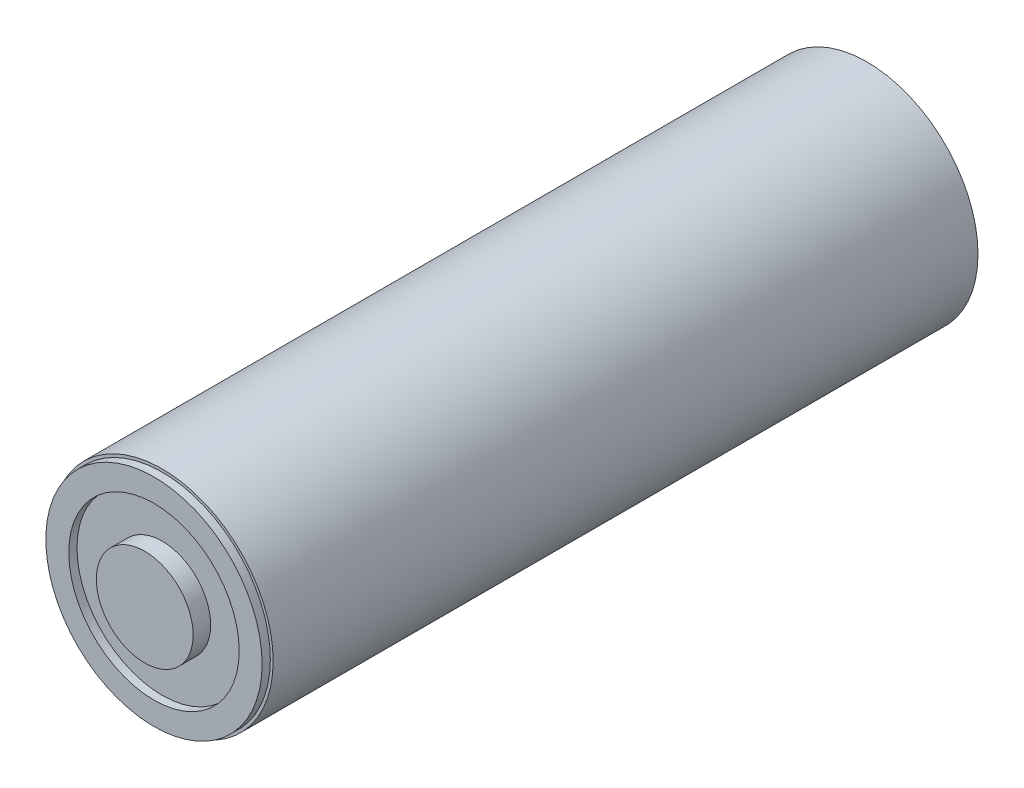
ISO-10303-21;
HEADER;
FILE_DESCRIPTION(('STEP AP214'),'2;1');
FILE_NAME('part.step','',(''),(''),'','','');
FILE_SCHEMA(('AUTOMOTIVE_DESIGN { 1 0 10303 214 1 1 1 1 }'));
ENDSEC;
DATA;
#1=APPLICATION_CONTEXT('core data for automotive mechanical design processes');
#2=APPLICATION_PROTOCOL_DEFINITION('international standard','automotive_design',2000,#1);
#3=PRODUCT_CONTEXT('',#1,'mechanical');
#4=PRODUCT('Part','Part','',(#3));
#5=PRODUCT_RELATED_PRODUCT_CATEGORY('part','',(#4));
#6=PRODUCT_DEFINITION_FORMATION('','',#4);
#7=PRODUCT_DEFINITION_CONTEXT('part definition',#1,'design');
#8=PRODUCT_DEFINITION('design','',#6,#7);
#9=PRODUCT_DEFINITION_SHAPE('','',#8);
#10=(LENGTH_UNIT() NAMED_UNIT(*) SI_UNIT(.MILLI.,.METRE.));
#11=(NAMED_UNIT(*) PLANE_ANGLE_UNIT() SI_UNIT($,.RADIAN.));
#12=(NAMED_UNIT(*) SI_UNIT($,.STERADIAN.) SOLID_ANGLE_UNIT());
#13=UNCERTAINTY_MEASURE_WITH_UNIT(LENGTH_MEASURE(1.E-05),#10,'distance_accuracy_value','');
#14=(GEOMETRIC_REPRESENTATION_CONTEXT(3) GLOBAL_UNCERTAINTY_ASSIGNED_CONTEXT((#13)) GLOBAL_UNIT_ASSIGNED_CONTEXT((#10,
#11,#12)) REPRESENTATION_CONTEXT('',''));
#15=CARTESIAN_POINT('',(0.,0.,0.));
#16=DIRECTION('',(0.,0.,1.));
#17=DIRECTION('',(1.,0.,0.));
#18=AXIS2_PLACEMENT_3D('',#15,#16,#17);
#19=CARTESIAN_POINT('',(0.,0.,68.45));
#20=DIRECTION('',(0.,0.,-1.));
#21=DIRECTION('',(-1.,0.,0.));
#22=AXIS2_PLACEMENT_3D('',#19,#20,#21);
#23=CYLINDRICAL_SURFACE('',#22,10.775);
#24=CARTESIAN_POINT('',(0.,0.,68.45));
#25=DIRECTION('',(0.,0.,1.));
#26=DIRECTION('',(1.,0.,0.));
#27=AXIS2_PLACEMENT_3D('',#24,#25,#26);
#28=CIRCLE('',#27,10.775);
#29=CARTESIAN_POINT('',(10.775,0.,68.45));
#30=VERTEX_POINT('',#29);
#31=EDGE_CURVE('E51',#30,#30,#28,.T.);
#32=ORIENTED_EDGE('',*,*,#31,.F.);
#33=EDGE_LOOP('',(#32));
#34=FACE_BOUND('',#33,.T.);
#35=CARTESIAN_POINT('',(0.,0.,0.));
#36=DIRECTION('',(0.,0.,1.));
#37=DIRECTION('',(1.,0.,0.));
#38=AXIS2_PLACEMENT_3D('',#35,#36,#37);
#39=CIRCLE('',#38,10.775);
#40=CARTESIAN_POINT('',(10.775,0.,0.));
#41=VERTEX_POINT('',#40);
#42=EDGE_CURVE('E56',#41,#41,#39,.T.);
#43=ORIENTED_EDGE('',*,*,#42,.T.);
#44=EDGE_LOOP('',(#43));
#45=FACE_BOUND('',#44,.T.);
#46=ADVANCED_FACE('F41',(#34,#45),#23,.T.);
#47=CARTESIAN_POINT('',(0.,0.,68.45));
#48=DIRECTION('',(0.,0.,1.));
#49=DIRECTION('',(1.,0.,0.));
#50=AXIS2_PLACEMENT_3D('',#47,#48,#49);
#51=PLANE('',#50);
#52=CARTESIAN_POINT('',(0.,0.,68.45));
#53=DIRECTION('',(0.,0.,1.));
#54=DIRECTION('',(1.,0.,0.));
#55=AXIS2_PLACEMENT_3D('',#52,#53,#54);
#56=CIRCLE('',#55,10.5);
#57=CARTESIAN_POINT('',(10.5,0.,68.45));
#58=VERTEX_POINT('',#57);
#59=EDGE_CURVE('E69',#58,#58,#56,.T.);
#60=ORIENTED_EDGE('',*,*,#59,.F.);
#61=EDGE_LOOP('',(#60));
#62=FACE_BOUND('',#61,.T.);
#63=ORIENTED_EDGE('',*,*,#31,.T.);
#64=EDGE_LOOP('',(#63));
#65=FACE_BOUND('',#64,.T.);
#66=ADVANCED_FACE('F93',(#62,#65),#51,.T.);
#67=CARTESIAN_POINT('',(0.,0.,0.));
#68=DIRECTION('',(0.,0.,1.));
#69=DIRECTION('',(1.,0.,0.));
#70=AXIS2_PLACEMENT_3D('',#67,#68,#69);
#71=PLANE('',#70);
#72=ORIENTED_EDGE('',*,*,#42,.F.);
#73=EDGE_LOOP('',(#72));
#74=FACE_BOUND('',#73,.T.);
#75=ADVANCED_FACE('F84',(#74),#71,.F.);
#76=CARTESIAN_POINT('',(0.,0.,69.25));
#77=DIRECTION('',(0.,0.,1.));
#78=DIRECTION('',(1.,0.,0.));
#79=AXIS2_PLACEMENT_3D('',#76,#77,#78);
#80=PLANE('',#79);
#81=CARTESIAN_POINT('',(0.,0.,69.25));
#82=DIRECTION('',(0.,0.,1.));
#83=DIRECTION('',(1.,0.,0.));
#84=AXIS2_PLACEMENT_3D('',#81,#82,#83);
#85=CIRCLE('',#84,10.5);
#86=CARTESIAN_POINT('',(10.5,0.,69.25));
#87=VERTEX_POINT('',#86);
#88=EDGE_CURVE('E65',#87,#87,#85,.T.);
#89=ORIENTED_EDGE('',*,*,#88,.T.);
#90=EDGE_LOOP('',(#89));
#91=FACE_BOUND('',#90,.T.);
#92=CARTESIAN_POINT('',(0.,0.,69.25));
#93=DIRECTION('',(0.,0.,1.));
#94=DIRECTION('',(1.,0.,0.));
#95=AXIS2_PLACEMENT_3D('',#92,#93,#94);
#96=CIRCLE('',#95,8.275);
#97=CARTESIAN_POINT('',(8.275,0.,69.25));
#98=VERTEX_POINT('',#97);
#99=EDGE_CURVE('E74',#98,#98,#96,.T.);
#100=ORIENTED_EDGE('',*,*,#99,.F.);
#101=EDGE_LOOP('',(#100));
#102=FACE_BOUND('',#101,.T.);
#103=ADVANCED_FACE('F81',(#91,#102),#80,.T.);
#104=CARTESIAN_POINT('',(0.,0.,69.25));
#105=DIRECTION('',(0.,0.,-1.));
#106=DIRECTION('',(-1.,0.,0.));
#107=AXIS2_PLACEMENT_3D('',#104,#105,#106);
#108=CYLINDRICAL_SURFACE('',#107,10.5);
#109=ORIENTED_EDGE('',*,*,#88,.F.);
#110=EDGE_LOOP('',(#109));
#111=FACE_BOUND('',#110,.T.);
#112=ORIENTED_EDGE('',*,*,#59,.T.);
#113=EDGE_LOOP('',(#112));
#114=FACE_BOUND('',#113,.T.);
#115=ADVANCED_FACE('F83',(#111,#114),#108,.T.);
#116=CARTESIAN_POINT('',(0.,0.,69.25));
#117=DIRECTION('',(0.,0.,-1.));
#118=DIRECTION('',(-1.,0.,0.));
#119=AXIS2_PLACEMENT_3D('',#116,#117,#118);
#120=CYLINDRICAL_SURFACE('',#119,8.275);
#121=ORIENTED_EDGE('',*,*,#99,.T.);
#122=EDGE_LOOP('',(#121));
#123=FACE_BOUND('',#122,.T.);
#124=CARTESIAN_POINT('',(0.,0.,68.45));
#125=DIRECTION('',(0.,0.,1.));
#126=DIRECTION('',(1.,0.,0.));
#127=AXIS2_PLACEMENT_3D('',#124,#125,#126);
#128=CIRCLE('',#127,8.275);
#129=CARTESIAN_POINT('',(8.275,0.,68.45));
#130=VERTEX_POINT('',#129);
#131=EDGE_CURVE('E10',#130,#130,#128,.F.);
#132=ORIENTED_EDGE('',*,*,#131,.T.);
#133=EDGE_LOOP('',(#132));
#134=FACE_BOUND('',#133,.T.);
#135=ADVANCED_FACE('F79',(#123,#134),#120,.F.);
#136=CARTESIAN_POINT('',(0.,0.,70.15));
#137=DIRECTION('',(0.,0.,1.));
#138=DIRECTION('',(1.,0.,0.));
#139=AXIS2_PLACEMENT_3D('',#136,#137,#138);
#140=PLANE('',#139);
#141=CARTESIAN_POINT('',(0.,0.,70.15));
#142=DIRECTION('',(0.,0.,1.));
#143=DIRECTION('',(1.,0.,0.));
#144=AXIS2_PLACEMENT_3D('',#141,#142,#143);
#145=CIRCLE('',#144,4.7);
#146=CARTESIAN_POINT('',(4.7,0.,70.15));
#147=VERTEX_POINT('',#146);
#148=EDGE_CURVE('E59',#147,#147,#145,.T.);
#149=ORIENTED_EDGE('',*,*,#148,.T.);
#150=EDGE_LOOP('',(#149));
#151=FACE_BOUND('',#150,.T.);
#152=ADVANCED_FACE('F117',(#151),#140,.T.);
#153=CARTESIAN_POINT('',(0.,0.,70.15));
#154=DIRECTION('',(0.,0.,-1.));
#155=DIRECTION('',(-1.,0.,0.));
#156=AXIS2_PLACEMENT_3D('',#153,#154,#155);
#157=CYLINDRICAL_SURFACE('',#156,4.7);
#158=ORIENTED_EDGE('',*,*,#148,.F.);
#159=EDGE_LOOP('',(#158));
#160=FACE_BOUND('',#159,.T.);
#161=CARTESIAN_POINT('',(0.,0.,68.45));
#162=DIRECTION('',(0.,0.,1.));
#163=DIRECTION('',(1.,0.,0.));
#164=AXIS2_PLACEMENT_3D('',#161,#162,#163);
#165=CIRCLE('',#164,4.7);
#166=CARTESIAN_POINT('',(4.7,0.,68.45));
#167=VERTEX_POINT('',#166);
#168=EDGE_CURVE('E47',#167,#167,#165,.T.);
#169=ORIENTED_EDGE('',*,*,#168,.T.);
#170=EDGE_LOOP('',(#169));
#171=FACE_BOUND('',#170,.T.);
#172=ADVANCED_FACE('F111',(#160,#171),#157,.T.);
#173=ORIENTED_EDGE('',*,*,#168,.F.);
#174=EDGE_LOOP('',(#173));
#175=FACE_BOUND('',#174,.T.);
#176=ORIENTED_EDGE('',*,*,#131,.F.);
#177=EDGE_LOOP('',(#176));
#178=FACE_BOUND('',#177,.T.);
#179=ADVANCED_FACE('F102',(#175,#178),#51,.T.);
#180=CLOSED_SHELL('',(#46,#66,#75,#103,#115,#135,#152,#172,#179));
#181=MANIFOLD_SOLID_BREP('B2',#180);
#182=ADVANCED_BREP_SHAPE_REPRESENTATION('',(#18,#181),#14);
#183=SHAPE_DEFINITION_REPRESENTATION(#9,#182);
ENDSEC;
END-ISO-10303-21;
